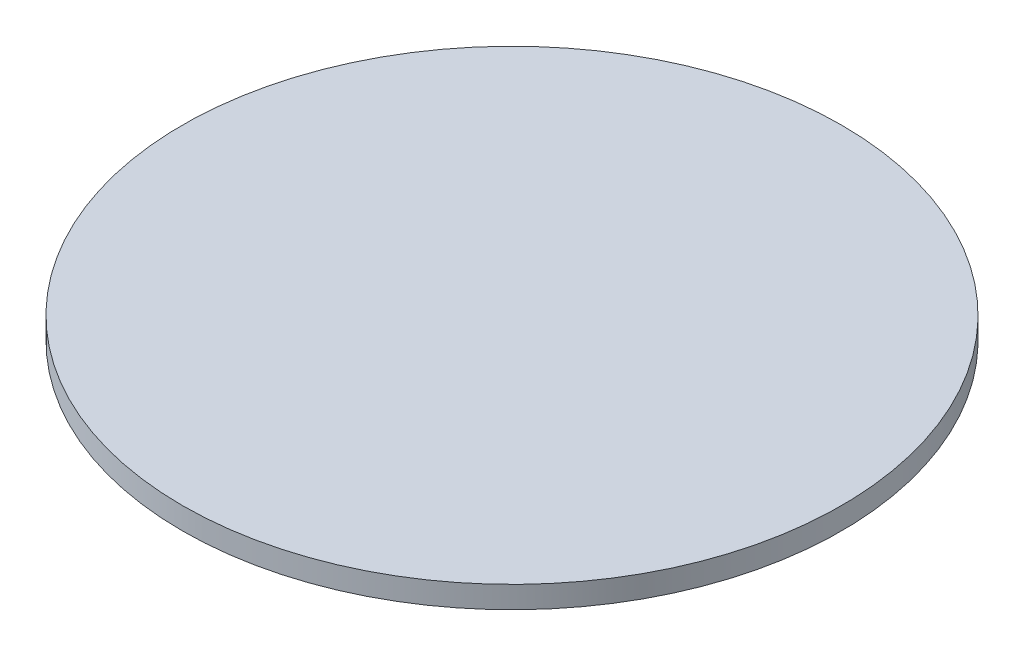
ISO-10303-21;
HEADER;
FILE_DESCRIPTION(('STEP AP214'),'2;1');
FILE_NAME('part.step','',(''),(''),'','','');
FILE_SCHEMA(('AUTOMOTIVE_DESIGN { 1 0 10303 214 1 1 1 1 }'));
ENDSEC;
DATA;
#1=APPLICATION_CONTEXT('core data for automotive mechanical design processes');
#2=APPLICATION_PROTOCOL_DEFINITION('international standard','automotive_design',2000,#1);
#3=PRODUCT_CONTEXT('',#1,'mechanical');
#4=PRODUCT('Part','Part','',(#3));
#5=PRODUCT_RELATED_PRODUCT_CATEGORY('part','',(#4));
#6=PRODUCT_DEFINITION_FORMATION('','',#4);
#7=PRODUCT_DEFINITION_CONTEXT('part definition',#1,'design');
#8=PRODUCT_DEFINITION('design','',#6,#7);
#9=PRODUCT_DEFINITION_SHAPE('','',#8);
#10=(LENGTH_UNIT() NAMED_UNIT(*) SI_UNIT(.MILLI.,.METRE.));
#11=(NAMED_UNIT(*) PLANE_ANGLE_UNIT() SI_UNIT($,.RADIAN.));
#12=(NAMED_UNIT(*) SI_UNIT($,.STERADIAN.) SOLID_ANGLE_UNIT());
#13=UNCERTAINTY_MEASURE_WITH_UNIT(LENGTH_MEASURE(1.E-05),#10,'distance_accuracy_value','');
#14=(GEOMETRIC_REPRESENTATION_CONTEXT(3) GLOBAL_UNCERTAINTY_ASSIGNED_CONTEXT((#13)) GLOBAL_UNIT_ASSIGNED_CONTEXT((#10,
#11,#12)) REPRESENTATION_CONTEXT('',''));
#15=CARTESIAN_POINT('',(0.,0.,0.));
#16=DIRECTION('',(0.,0.,1.));
#17=DIRECTION('',(1.,0.,0.));
#18=AXIS2_PLACEMENT_3D('',#15,#16,#17);
#19=CARTESIAN_POINT('',(0.,5.,0.));
#20=DIRECTION('',(0.,-1.,0.));
#21=DIRECTION('',(0.,0.,-1.));
#22=AXIS2_PLACEMENT_3D('',#19,#20,#21);
#23=CYLINDRICAL_SURFACE('',#22,75.);
#24=CARTESIAN_POINT('',(0.,5.,0.));
#25=DIRECTION('',(0.,1.,0.));
#26=DIRECTION('',(0.,0.,1.));
#27=AXIS2_PLACEMENT_3D('',#24,#25,#26);
#28=CIRCLE('',#27,75.);
#29=CARTESIAN_POINT('',(0.,5.,75.));
#30=VERTEX_POINT('',#29);
#31=EDGE_CURVE('E10',#30,#30,#28,.T.);
#32=ORIENTED_EDGE('',*,*,#31,.F.);
#33=EDGE_LOOP('',(#32));
#34=FACE_BOUND('',#33,.T.);
#35=CARTESIAN_POINT('',(0.,0.,0.));
#36=DIRECTION('',(0.,1.,0.));
#37=DIRECTION('',(0.,0.,1.));
#38=AXIS2_PLACEMENT_3D('',#35,#36,#37);
#39=CIRCLE('',#38,75.);
#40=CARTESIAN_POINT('',(0.,0.,75.));
#41=VERTEX_POINT('',#40);
#42=EDGE_CURVE('E40',#41,#41,#39,.T.);
#43=ORIENTED_EDGE('',*,*,#42,.T.);
#44=EDGE_LOOP('',(#43));
#45=FACE_BOUND('',#44,.T.);
#46=ADVANCED_FACE('F37',(#34,#45),#23,.T.);
#47=CARTESIAN_POINT('',(0.,5.,0.));
#48=DIRECTION('',(0.,1.,0.));
#49=DIRECTION('',(0.,0.,1.));
#50=AXIS2_PLACEMENT_3D('',#47,#48,#49);
#51=PLANE('',#50);
#52=ORIENTED_EDGE('',*,*,#31,.T.);
#53=EDGE_LOOP('',(#52));
#54=FACE_BOUND('',#53,.T.);
#55=ADVANCED_FACE('F54',(#54),#51,.T.);
#56=CARTESIAN_POINT('',(0.,0.,0.));
#57=DIRECTION('',(0.,1.,0.));
#58=DIRECTION('',(0.,0.,1.));
#59=AXIS2_PLACEMENT_3D('',#56,#57,#58);
#60=PLANE('',#59);
#61=ORIENTED_EDGE('',*,*,#42,.F.);
#62=EDGE_LOOP('',(#61));
#63=FACE_BOUND('',#62,.T.);
#64=ADVANCED_FACE('F52',(#63),#60,.F.);
#65=CLOSED_SHELL('',(#46,#55,#64));
#66=MANIFOLD_SOLID_BREP('B2',#65);
#67=ADVANCED_BREP_SHAPE_REPRESENTATION('',(#18,#66),#14);
#68=SHAPE_DEFINITION_REPRESENTATION(#9,#67);
ENDSEC;
END-ISO-10303-21;
